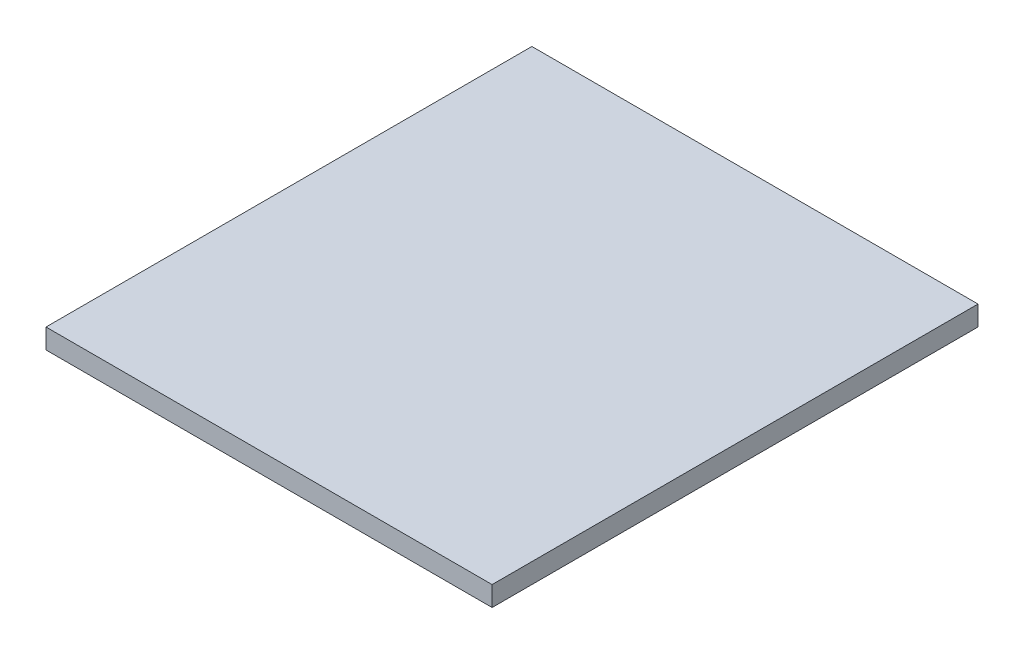
ISO-10303-21;
HEADER;
FILE_DESCRIPTION(('STEP AP214'),'2;1');
FILE_NAME('part.step','',(''),(''),'','','');
FILE_SCHEMA(('AUTOMOTIVE_DESIGN { 1 0 10303 214 1 1 1 1 }'));
ENDSEC;
DATA;
#1=APPLICATION_CONTEXT('core data for automotive mechanical design processes');
#2=APPLICATION_PROTOCOL_DEFINITION('international standard','automotive_design',2000,#1);
#3=PRODUCT_CONTEXT('',#1,'mechanical');
#4=PRODUCT('Part','Part','',(#3));
#5=PRODUCT_RELATED_PRODUCT_CATEGORY('part','',(#4));
#6=PRODUCT_DEFINITION_FORMATION('','',#4);
#7=PRODUCT_DEFINITION_CONTEXT('part definition',#1,'design');
#8=PRODUCT_DEFINITION('design','',#6,#7);
#9=PRODUCT_DEFINITION_SHAPE('','',#8);
#10=(LENGTH_UNIT() NAMED_UNIT(*) SI_UNIT(.MILLI.,.METRE.));
#11=(NAMED_UNIT(*) PLANE_ANGLE_UNIT() SI_UNIT($,.RADIAN.));
#12=(NAMED_UNIT(*) SI_UNIT($,.STERADIAN.) SOLID_ANGLE_UNIT());
#13=UNCERTAINTY_MEASURE_WITH_UNIT(LENGTH_MEASURE(1.E-05),#10,'distance_accuracy_value','');
#14=(GEOMETRIC_REPRESENTATION_CONTEXT(3) GLOBAL_UNCERTAINTY_ASSIGNED_CONTEXT((#13)) GLOBAL_UNIT_ASSIGNED_CONTEXT((#10,
#11,#12)) REPRESENTATION_CONTEXT('',''));
#15=CARTESIAN_POINT('',(0.,0.,0.));
#16=DIRECTION('',(0.,0.,1.));
#17=DIRECTION('',(1.,0.,0.));
#18=AXIS2_PLACEMENT_3D('',#15,#16,#17);
#19=CARTESIAN_POINT('',(4.99999999999999,-12.5,595.283022995056));
#20=DIRECTION('',(1.,0.,0.));
#21=DIRECTION('',(0.,0.,-1.));
#22=AXIS2_PLACEMENT_3D('',#19,#20,#21);
#23=PLANE('',#22);
#24=DIRECTION('',(0.,-1.,0.));
#25=VECTOR('',#24,1.);
#26=CARTESIAN_POINT('',(4.99999999999999,-12.5,310.2));
#27=LINE('',#26,#25);
#28=CARTESIAN_POINT('',(4.99999999999999,0.200000000000002,310.2));
#29=VERTEX_POINT('',#28);
#30=CARTESIAN_POINT('',(4.99999999999999,-12.5,310.2));
#31=VERTEX_POINT('',#30);
#32=EDGE_CURVE('E82',#29,#31,#27,.T.);
#33=ORIENTED_EDGE('',*,*,#32,.F.);
#34=DIRECTION('',(0.,0.,-1.));
#35=VECTOR('',#34,1.);
#36=CARTESIAN_POINT('',(4.99999999999999,0.200000000000002,595.283022995056));
#37=LINE('',#36,#35);
#38=CARTESIAN_POINT('',(4.99999999999999,0.200000000000002,0.));
#39=VERTEX_POINT('',#38);
#40=EDGE_CURVE('E36',#29,#39,#37,.T.);
#41=ORIENTED_EDGE('',*,*,#40,.T.);
#42=DIRECTION('',(0.,-1.,0.));
#43=VECTOR('',#42,1.);
#44=CARTESIAN_POINT('',(4.99999999999999,-12.5,0.));
#45=LINE('',#44,#43);
#46=CARTESIAN_POINT('',(4.99999999999999,-12.5,0.));
#47=VERTEX_POINT('',#46);
#48=EDGE_CURVE('E80',#39,#47,#45,.T.);
#49=ORIENTED_EDGE('',*,*,#48,.T.);
#50=DIRECTION('',(0.,0.,-1.));
#51=VECTOR('',#50,1.);
#52=CARTESIAN_POINT('',(4.99999999999999,-12.5,595.283022995056));
#53=LINE('',#52,#51);
#54=EDGE_CURVE('E71',#31,#47,#53,.T.);
#55=ORIENTED_EDGE('',*,*,#54,.F.);
#56=EDGE_LOOP('',(#33,#41,#49,#55));
#57=FACE_BOUND('',#56,.T.);
#58=ADVANCED_FACE('F32',(#57),#23,.F.);
#59=CARTESIAN_POINT('',(4.99999999999999,-12.5,595.283022995056));
#60=DIRECTION('',(0.,1.,0.));
#61=DIRECTION('',(0.,0.,1.));
#62=AXIS2_PLACEMENT_3D('',#59,#60,#61);
#63=PLANE('',#62);
#64=DIRECTION('',(1.,0.,0.));
#65=VECTOR('',#64,1.);
#66=CARTESIAN_POINT('',(4.99999999999999,-12.5,310.2));
#67=LINE('',#66,#65);
#68=CARTESIAN_POINT('',(289.8,-12.5,310.2));
#69=VERTEX_POINT('',#68);
#70=EDGE_CURVE('E41',#31,#69,#67,.T.);
#71=ORIENTED_EDGE('',*,*,#70,.F.);
#72=ORIENTED_EDGE('',*,*,#54,.T.);
#73=DIRECTION('',(1.,0.,0.));
#74=VECTOR('',#73,1.);
#75=CARTESIAN_POINT('',(4.99999999999999,-12.5,0.));
#76=LINE('',#75,#74);
#77=CARTESIAN_POINT('',(289.8,-12.5,0.));
#78=VERTEX_POINT('',#77);
#79=EDGE_CURVE('E92',#47,#78,#76,.T.);
#80=ORIENTED_EDGE('',*,*,#79,.T.);
#81=DIRECTION('',(0.,0.,-1.));
#82=VECTOR('',#81,1.);
#83=CARTESIAN_POINT('',(289.8,-12.5,595.283022995056));
#84=LINE('',#83,#82);
#85=EDGE_CURVE('E101',#69,#78,#84,.T.);
#86=ORIENTED_EDGE('',*,*,#85,.F.);
#87=EDGE_LOOP('',(#71,#72,#80,#86));
#88=FACE_BOUND('',#87,.T.);
#89=ADVANCED_FACE('F105',(#88),#63,.F.);
#90=CARTESIAN_POINT('',(289.8,-12.5,595.283022995056));
#91=DIRECTION('',(-1.,0.,0.));
#92=DIRECTION('',(0.,0.,1.));
#93=AXIS2_PLACEMENT_3D('',#90,#91,#92);
#94=PLANE('',#93);
#95=DIRECTION('',(0.,1.,0.));
#96=VECTOR('',#95,1.);
#97=CARTESIAN_POINT('',(289.8,-12.5,310.2));
#98=LINE('',#97,#96);
#99=CARTESIAN_POINT('',(289.8,0.200000000000002,310.2));
#100=VERTEX_POINT('',#99);
#101=EDGE_CURVE('E11',#69,#100,#98,.T.);
#102=ORIENTED_EDGE('',*,*,#101,.F.);
#103=ORIENTED_EDGE('',*,*,#85,.T.);
#104=DIRECTION('',(0.,1.,0.));
#105=VECTOR('',#104,1.);
#106=CARTESIAN_POINT('',(289.8,-12.5,0.));
#107=LINE('',#106,#105);
#108=CARTESIAN_POINT('',(289.8,0.200000000000002,0.));
#109=VERTEX_POINT('',#108);
#110=EDGE_CURVE('E102',#78,#109,#107,.T.);
#111=ORIENTED_EDGE('',*,*,#110,.T.);
#112=DIRECTION('',(0.,0.,-1.));
#113=VECTOR('',#112,1.);
#114=CARTESIAN_POINT('',(289.8,0.200000000000002,595.283022995056));
#115=LINE('',#114,#113);
#116=EDGE_CURVE('E54',#100,#109,#115,.T.);
#117=ORIENTED_EDGE('',*,*,#116,.F.);
#118=EDGE_LOOP('',(#102,#103,#111,#117));
#119=FACE_BOUND('',#118,.T.);
#120=ADVANCED_FACE('F104',(#119),#94,.F.);
#121=CARTESIAN_POINT('',(4.99999999999999,0.200000000000002,595.283022995056));
#122=DIRECTION('',(0.,-1.,0.));
#123=DIRECTION('',(0.,0.,-1.));
#124=AXIS2_PLACEMENT_3D('',#121,#122,#123);
#125=PLANE('',#124);
#126=DIRECTION('',(-1.,0.,0.));
#127=VECTOR('',#126,1.);
#128=CARTESIAN_POINT('',(4.99999999999999,0.200000000000002,310.2));
#129=LINE('',#128,#127);
#130=EDGE_CURVE('E89',#100,#29,#129,.T.);
#131=ORIENTED_EDGE('',*,*,#130,.F.);
#132=ORIENTED_EDGE('',*,*,#116,.T.);
#133=DIRECTION('',(-1.,0.,0.));
#134=VECTOR('',#133,1.);
#135=CARTESIAN_POINT('',(4.99999999999999,0.200000000000002,0.));
#136=LINE('',#135,#134);
#137=EDGE_CURVE('E85',#109,#39,#136,.T.);
#138=ORIENTED_EDGE('',*,*,#137,.T.);
#139=ORIENTED_EDGE('',*,*,#40,.F.);
#140=EDGE_LOOP('',(#131,#132,#138,#139));
#141=FACE_BOUND('',#140,.T.);
#142=ADVANCED_FACE('F86',(#141),#125,.F.);
#143=CARTESIAN_POINT('',(0.,0.,0.));
#144=DIRECTION('',(0.,0.,-1.));
#145=DIRECTION('',(-1.,0.,0.));
#146=AXIS2_PLACEMENT_3D('',#143,#144,#145);
#147=PLANE('',#146);
#148=ORIENTED_EDGE('',*,*,#48,.F.);
#149=ORIENTED_EDGE('',*,*,#137,.F.);
#150=ORIENTED_EDGE('',*,*,#110,.F.);
#151=ORIENTED_EDGE('',*,*,#79,.F.);
#152=EDGE_LOOP('',(#148,#149,#150,#151));
#153=FACE_BOUND('',#152,.T.);
#154=ADVANCED_FACE('F91',(#153),#147,.T.);
#155=CARTESIAN_POINT('',(0.,0.,310.2));
#156=DIRECTION('',(0.,0.,1.));
#157=DIRECTION('',(1.,0.,0.));
#158=AXIS2_PLACEMENT_3D('',#155,#156,#157);
#159=PLANE('',#158);
#160=ORIENTED_EDGE('',*,*,#130,.T.);
#161=ORIENTED_EDGE('',*,*,#32,.T.);
#162=ORIENTED_EDGE('',*,*,#70,.T.);
#163=ORIENTED_EDGE('',*,*,#101,.T.);
#164=EDGE_LOOP('',(#160,#161,#162,#163));
#165=FACE_BOUND('',#164,.T.);
#166=ADVANCED_FACE('F34',(#165),#159,.T.);
#167=CLOSED_SHELL('',(#58,#89,#120,#142,#154,#166));
#168=MANIFOLD_SOLID_BREP('B2',#167);
#169=ADVANCED_BREP_SHAPE_REPRESENTATION('',(#18,#168),#14);
#170=SHAPE_DEFINITION_REPRESENTATION(#9,#169);
ENDSEC;
END-ISO-10303-21;
